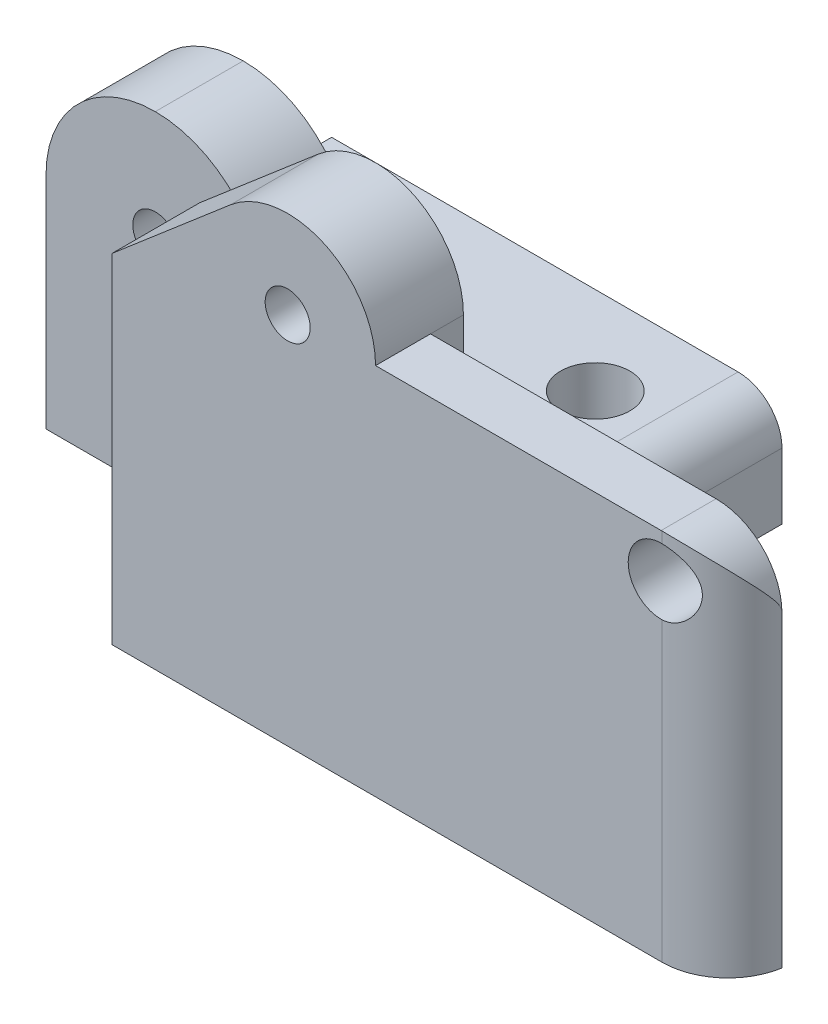
ISO-10303-21;
HEADER;
FILE_DESCRIPTION(('STEP AP214'),'2;1');
FILE_NAME('part.step','',(''),(''),'','','');
FILE_SCHEMA(('AUTOMOTIVE_DESIGN { 1 0 10303 214 1 1 1 1 }'));
ENDSEC;
DATA;
#1=APPLICATION_CONTEXT('core data for automotive mechanical design processes');
#2=APPLICATION_PROTOCOL_DEFINITION('international standard','automotive_design',2000,#1);
#3=PRODUCT_CONTEXT('',#1,'mechanical');
#4=PRODUCT('Part','Part','',(#3));
#5=PRODUCT_RELATED_PRODUCT_CATEGORY('part','',(#4));
#6=PRODUCT_DEFINITION_FORMATION('','',#4);
#7=PRODUCT_DEFINITION_CONTEXT('part definition',#1,'design');
#8=PRODUCT_DEFINITION('design','',#6,#7);
#9=PRODUCT_DEFINITION_SHAPE('','',#8);
#10=(LENGTH_UNIT() NAMED_UNIT(*) SI_UNIT(.MILLI.,.METRE.));
#11=(NAMED_UNIT(*) PLANE_ANGLE_UNIT() SI_UNIT($,.RADIAN.));
#12=(NAMED_UNIT(*) SI_UNIT($,.STERADIAN.) SOLID_ANGLE_UNIT());
#13=UNCERTAINTY_MEASURE_WITH_UNIT(LENGTH_MEASURE(1.E-05),#10,'distance_accuracy_value','');
#14=(GEOMETRIC_REPRESENTATION_CONTEXT(3) GLOBAL_UNCERTAINTY_ASSIGNED_CONTEXT((#13)) GLOBAL_UNIT_ASSIGNED_CONTEXT((#10,
#11,#12)) REPRESENTATION_CONTEXT('',''));
#15=CARTESIAN_POINT('',(0.,0.,0.));
#16=DIRECTION('',(0.,0.,1.));
#17=DIRECTION('',(1.,0.,0.));
#18=AXIS2_PLACEMENT_3D('',#15,#16,#17);
#19=CARTESIAN_POINT('',(16.,17.,20.));
#20=DIRECTION('',(-1.,0.,0.));
#21=DIRECTION('',(0.,0.,1.));
#22=AXIS2_PLACEMENT_3D('',#19,#20,#21);
#23=PLANE('',#22);
#24=DIRECTION('',(0.,1.,0.));
#25=VECTOR('',#24,1.);
#26=CARTESIAN_POINT('',(16.,0.,17.5));
#27=LINE('',#26,#25);
#28=CARTESIAN_POINT('',(16.,0.,17.5));
#29=VERTEX_POINT('',#28);
#30=CARTESIAN_POINT('',(16.,17.,17.5));
#31=VERTEX_POINT('',#30);
#32=EDGE_CURVE('E213',#29,#31,#27,.T.);
#33=ORIENTED_EDGE('',*,*,#32,.F.);
#34=DIRECTION('',(0.,0.,-1.));
#35=VECTOR('',#34,1.);
#36=CARTESIAN_POINT('',(16.,0.,20.));
#37=LINE('',#36,#35);
#38=CARTESIAN_POINT('',(16.,0.,16.));
#39=VERTEX_POINT('',#38);
#40=EDGE_CURVE('E439',#29,#39,#37,.T.);
#41=ORIENTED_EDGE('',*,*,#40,.T.);
#42=DIRECTION('',(0.,-1.,0.));
#43=VECTOR('',#42,1.);
#44=CARTESIAN_POINT('',(16.,5.,16.));
#45=LINE('',#44,#43);
#46=CARTESIAN_POINT('',(16.,17.,16.));
#47=VERTEX_POINT('',#46);
#48=EDGE_CURVE('E411',#47,#39,#45,.T.);
#49=ORIENTED_EDGE('',*,*,#48,.F.);
#50=DIRECTION('',(0.,0.,-1.));
#51=VECTOR('',#50,1.);
#52=CARTESIAN_POINT('',(16.,17.,20.));
#53=LINE('',#52,#51);
#54=EDGE_CURVE('E435',#31,#47,#53,.T.);
#55=ORIENTED_EDGE('',*,*,#54,.F.);
#56=EDGE_LOOP('',(#33,#41,#49,#55));
#57=FACE_BOUND('',#56,.T.);
#58=ADVANCED_FACE('F41',(#57),#23,.F.);
#59=CARTESIAN_POINT('',(12.,17.,20.));
#60=DIRECTION('',(0.,0.,-1.));
#61=DIRECTION('',(-1.,0.,0.));
#62=AXIS2_PLACEMENT_3D('',#59,#60,#61);
#63=PLANE('',#62);
#64=DIRECTION('',(0.,1.,0.));
#65=VECTOR('',#64,1.);
#66=CARTESIAN_POINT('',(29.0419601084502,17.,20.));
#67=LINE('',#66,#65);
#68=CARTESIAN_POINT('',(29.0419601084502,0.,20.));
#69=VERTEX_POINT('',#68);
#70=CARTESIAN_POINT('',(29.0419601084502,13.5005869984228,20.));
#71=VERTEX_POINT('',#70);
#72=EDGE_CURVE('E190',#69,#71,#67,.T.);
#73=ORIENTED_EDGE('',*,*,#72,.T.);
#74=CARTESIAN_POINT('',(29.,15.,20.));
#75=DIRECTION('',(0.,0.,1.));
#76=DIRECTION('',(1.,0.,0.));
#77=AXIS2_PLACEMENT_3D('',#74,#75,#76);
#78=CIRCLE('',#77,1.5);
#79=CARTESIAN_POINT('',(29.0419601084502,16.4994130015772,20.));
#80=VERTEX_POINT('',#79);
#81=EDGE_CURVE('E60',#80,#71,#78,.T.);
#82=ORIENTED_EDGE('',*,*,#81,.F.);
#83=CARTESIAN_POINT('',(29.0419601084502,16.9997065438637,20.));
#84=VERTEX_POINT('',#83);
#85=EDGE_CURVE('E187',#80,#84,#67,.T.);
#86=ORIENTED_EDGE('',*,*,#85,.T.);
#87=CARTESIAN_POINT('',(29.,14.,20.));
#88=DIRECTION('',(0.,0.,-1.));
#89=DIRECTION('',(-1.,0.,0.));
#90=AXIS2_PLACEMENT_3D('',#87,#88,#89);
#91=CIRCLE('',#90,3.);
#92=CARTESIAN_POINT('',(29.,17.,20.));
#93=VERTEX_POINT('',#92);
#94=EDGE_CURVE('E199',#84,#93,#91,.F.);
#95=ORIENTED_EDGE('',*,*,#94,.T.);
#96=DIRECTION('',(-1.,0.,0.));
#97=VECTOR('',#96,1.);
#98=CARTESIAN_POINT('',(32.,17.,20.));
#99=LINE('',#98,#97);
#100=CARTESIAN_POINT('',(16.,17.,20.));
#101=VERTEX_POINT('',#100);
#102=EDGE_CURVE('E323',#93,#101,#99,.T.);
#103=ORIENTED_EDGE('',*,*,#102,.T.);
#104=CARTESIAN_POINT('',(12.,17.,20.));
#105=DIRECTION('',(0.,0.,1.));
#106=DIRECTION('',(-1.,0.,0.));
#107=AXIS2_PLACEMENT_3D('',#104,#105,#106);
#108=CIRCLE('',#107,4.);
#109=CARTESIAN_POINT('',(9.40008084297598,20.0398059768577,20.));
#110=VERTEX_POINT('',#109);
#111=EDGE_CURVE('E425',#101,#110,#108,.T.);
#112=ORIENTED_EDGE('',*,*,#111,.T.);
#113=DIRECTION('',(-0.759951494214413,-0.649979789256005,0.));
#114=VECTOR('',#113,1.);
#115=CARTESIAN_POINT('',(0.,12.,20.));
#116=LINE('',#115,#114);
#117=CARTESIAN_POINT('',(4.,15.4211646096066,20.));
#118=VERTEX_POINT('',#117);
#119=EDGE_CURVE('E427',#110,#118,#116,.T.);
#120=ORIENTED_EDGE('',*,*,#119,.T.);
#121=DIRECTION('',(0.,1.,0.));
#122=VECTOR('',#121,1.);
#123=CARTESIAN_POINT('',(4.,0.,20.));
#124=LINE('',#123,#122);
#125=CARTESIAN_POINT('',(4.,0.,20.));
#126=VERTEX_POINT('',#125);
#127=EDGE_CURVE('E401',#126,#118,#124,.T.);
#128=ORIENTED_EDGE('',*,*,#127,.F.);
#129=DIRECTION('',(1.,0.,0.));
#130=VECTOR('',#129,1.);
#131=CARTESIAN_POINT('',(16.,0.,20.));
#132=LINE('',#131,#130);
#133=EDGE_CURVE('E423',#126,#69,#132,.T.);
#134=ORIENTED_EDGE('',*,*,#133,.T.);
#135=EDGE_LOOP('',(#73,#82,#86,#95,#103,#112,#120,#128,#134));
#136=FACE_BOUND('',#135,.T.);
#137=CARTESIAN_POINT('',(12.,17.,20.));
#138=DIRECTION('',(0.,0.,1.));
#139=DIRECTION('',(1.,0.,0.));
#140=AXIS2_PLACEMENT_3D('',#137,#138,#139);
#141=CIRCLE('',#140,1.025);
#142=CARTESIAN_POINT('',(13.025,17.,20.));
#143=VERTEX_POINT('',#142);
#144=EDGE_CURVE('E328',#143,#143,#141,.T.);
#145=ORIENTED_EDGE('',*,*,#144,.F.);
#146=EDGE_LOOP('',(#145));
#147=FACE_BOUND('',#146,.T.);
#148=ADVANCED_FACE('F185',(#136,#147),#63,.F.);
#149=CARTESIAN_POINT('',(-6.,5.,13.));
#150=DIRECTION('',(0.,0.,-1.));
#151=DIRECTION('',(-1.,0.,0.));
#152=AXIS2_PLACEMENT_3D('',#149,#150,#151);
#153=PLANE('',#152);
#154=DIRECTION('',(0.,-1.,0.));
#155=VECTOR('',#154,1.);
#156=CARTESIAN_POINT('',(3.95,15.,13.));
#157=LINE('',#156,#155);
#158=CARTESIAN_POINT('',(3.95,10.025,13.));
#159=VERTEX_POINT('',#158);
#160=CARTESIAN_POINT('',(3.95,5.,13.));
#161=VERTEX_POINT('',#160);
#162=EDGE_CURVE('E368',#159,#161,#157,.T.);
#163=ORIENTED_EDGE('',*,*,#162,.F.);
#164=CARTESIAN_POINT('',(-1.025,10.025,13.));
#165=DIRECTION('',(0.,0.,-1.));
#166=DIRECTION('',(-1.,0.,0.));
#167=AXIS2_PLACEMENT_3D('',#164,#165,#166);
#168=CIRCLE('',#167,4.975);
#169=CARTESIAN_POINT('',(-1.025,15.,13.));
#170=VERTEX_POINT('',#169);
#171=EDGE_CURVE('E460',#159,#170,#168,.F.);
#172=ORIENTED_EDGE('',*,*,#171,.T.);
#173=CARTESIAN_POINT('',(-1.025,10.025,13.));
#174=DIRECTION('',(0.,0.,-1.));
#175=DIRECTION('',(-1.,0.,0.));
#176=AXIS2_PLACEMENT_3D('',#173,#174,#175);
#177=CIRCLE('',#176,4.975);
#178=CARTESIAN_POINT('',(-6.,10.025,13.));
#179=VERTEX_POINT('',#178);
#180=EDGE_CURVE('E458',#170,#179,#177,.F.);
#181=ORIENTED_EDGE('',*,*,#180,.T.);
#182=DIRECTION('',(0.,1.,0.));
#183=VECTOR('',#182,1.);
#184=CARTESIAN_POINT('',(-6.,5.,13.));
#185=LINE('',#184,#183);
#186=CARTESIAN_POINT('',(-6.,0.,13.));
#187=VERTEX_POINT('',#186);
#188=EDGE_CURVE('E388',#187,#179,#185,.T.);
#189=ORIENTED_EDGE('',*,*,#188,.F.);
#190=DIRECTION('',(1.,0.,0.));
#191=VECTOR('',#190,1.);
#192=CARTESIAN_POINT('',(-6.,0.,13.));
#193=LINE('',#192,#191);
#194=CARTESIAN_POINT('',(4.,0.,13.));
#195=VERTEX_POINT('',#194);
#196=EDGE_CURVE('E398',#187,#195,#193,.T.);
#197=ORIENTED_EDGE('',*,*,#196,.T.);
#198=DIRECTION('',(0.,1.,0.));
#199=VECTOR('',#198,1.);
#200=CARTESIAN_POINT('',(4.,5.,13.));
#201=LINE('',#200,#199);
#202=CARTESIAN_POINT('',(4.,5.,13.));
#203=VERTEX_POINT('',#202);
#204=EDGE_CURVE('E386',#195,#203,#201,.T.);
#205=ORIENTED_EDGE('',*,*,#204,.T.);
#206=DIRECTION('',(1.,0.,0.));
#207=VECTOR('',#206,1.);
#208=CARTESIAN_POINT('',(-6.,5.,13.));
#209=LINE('',#208,#207);
#210=EDGE_CURVE('E394',#161,#203,#209,.T.);
#211=ORIENTED_EDGE('',*,*,#210,.F.);
#212=EDGE_LOOP('',(#163,#172,#181,#189,#197,#205,#211));
#213=FACE_BOUND('',#212,.T.);
#214=CARTESIAN_POINT('',(-1.025,10.025,13.));
#215=DIRECTION('',(0.,0.,1.));
#216=DIRECTION('',(1.,0.,0.));
#217=AXIS2_PLACEMENT_3D('',#214,#215,#216);
#218=CIRCLE('',#217,1.02499999999999);
#219=CARTESIAN_POINT('',(0.,10.025,13.));
#220=VERTEX_POINT('',#219);
#221=EDGE_CURVE('E349',#220,#220,#218,.T.);
#222=ORIENTED_EDGE('',*,*,#221,.F.);
#223=EDGE_LOOP('',(#222));
#224=FACE_BOUND('',#223,.T.);
#225=ADVANCED_FACE('F258',(#213,#224),#153,.F.);
#226=CARTESIAN_POINT('',(-4.,5.,0.));
#227=DIRECTION('',(0.,-1.,0.));
#228=DIRECTION('',(0.,0.,-1.));
#229=AXIS2_PLACEMENT_3D('',#226,#227,#228);
#230=PLANE('',#229);
#231=CARTESIAN_POINT('',(10.,5.,14.));
#232=DIRECTION('',(0.,-1.,0.));
#233=DIRECTION('',(0.,0.,-1.));
#234=AXIS2_PLACEMENT_3D('',#231,#232,#233);
#235=CIRCLE('',#234,1.575);
#236=CARTESIAN_POINT('',(10.,5.,12.425));
#237=VERTEX_POINT('',#236);
#238=EDGE_CURVE('E381',#237,#237,#235,.T.);
#239=ORIENTED_EDGE('',*,*,#238,.T.);
#240=EDGE_LOOP('',(#239));
#241=FACE_BOUND('',#240,.T.);
#242=CARTESIAN_POINT('',(10.,5.,4.));
#243=DIRECTION('',(0.,-1.,0.));
#244=DIRECTION('',(0.,0.,-1.));
#245=AXIS2_PLACEMENT_3D('',#242,#243,#244);
#246=CIRCLE('',#245,1.575);
#247=CARTESIAN_POINT('',(10.,5.,2.425));
#248=VERTEX_POINT('',#247);
#249=EDGE_CURVE('E377',#248,#248,#246,.T.);
#250=ORIENTED_EDGE('',*,*,#249,.T.);
#251=EDGE_LOOP('',(#250));
#252=FACE_BOUND('',#251,.T.);
#253=CARTESIAN_POINT('',(-2.,5.,4.));
#254=DIRECTION('',(0.,-1.,0.));
#255=DIRECTION('',(0.,0.,-1.));
#256=AXIS2_PLACEMENT_3D('',#253,#254,#255);
#257=CIRCLE('',#256,1.575);
#258=CARTESIAN_POINT('',(-2.,5.,2.425));
#259=VERTEX_POINT('',#258);
#260=EDGE_CURVE('E373',#259,#259,#257,.T.);
#261=ORIENTED_EDGE('',*,*,#260,.T.);
#262=EDGE_LOOP('',(#261));
#263=FACE_BOUND('',#262,.T.);
#264=DIRECTION('',(1.,0.,0.));
#265=VECTOR('',#264,1.);
#266=CARTESIAN_POINT('',(-4.,5.,16.));
#267=LINE('',#266,#265);
#268=CARTESIAN_POINT('',(4.,5.,16.));
#269=VERTEX_POINT('',#268);
#270=CARTESIAN_POINT('',(12.5,5.,16.));
#271=VERTEX_POINT('',#270);
#272=EDGE_CURVE('E414',#269,#271,#267,.T.);
#273=ORIENTED_EDGE('',*,*,#272,.T.);
#274=DIRECTION('',(0.,0.,1.));
#275=VECTOR('',#274,1.);
#276=CARTESIAN_POINT('',(12.5,5.,0.));
#277=LINE('',#276,#275);
#278=CARTESIAN_POINT('',(12.5,5.,0.));
#279=VERTEX_POINT('',#278);
#280=EDGE_CURVE('E469',#271,#279,#277,.F.);
#281=ORIENTED_EDGE('',*,*,#280,.T.);
#282=DIRECTION('',(-1.,0.,0.));
#283=VECTOR('',#282,1.);
#284=CARTESIAN_POINT('',(12.,5.,0.));
#285=LINE('',#284,#283);
#286=CARTESIAN_POINT('',(-6.,5.,0.));
#287=VERTEX_POINT('',#286);
#288=EDGE_CURVE('E441',#279,#287,#285,.T.);
#289=ORIENTED_EDGE('',*,*,#288,.T.);
#290=DIRECTION('',(0.,0.,-1.));
#291=VECTOR('',#290,1.);
#292=CARTESIAN_POINT('',(-6.,5.,0.));
#293=LINE('',#292,#291);
#294=CARTESIAN_POINT('',(-6.,5.,9.));
#295=VERTEX_POINT('',#294);
#296=EDGE_CURVE('E391',#295,#287,#293,.T.);
#297=ORIENTED_EDGE('',*,*,#296,.F.);
#298=DIRECTION('',(-1.,0.,0.));
#299=VECTOR('',#298,1.);
#300=CARTESIAN_POINT('',(-6.,5.,9.));
#301=LINE('',#300,#299);
#302=CARTESIAN_POINT('',(3.95,5.,9.));
#303=VERTEX_POINT('',#302);
#304=EDGE_CURVE('E361',#303,#295,#301,.T.);
#305=ORIENTED_EDGE('',*,*,#304,.F.);
#306=DIRECTION('',(0.,0.,-1.));
#307=VECTOR('',#306,1.);
#308=CARTESIAN_POINT('',(3.95,5.,13.));
#309=LINE('',#308,#307);
#310=EDGE_CURVE('E358',#161,#303,#309,.T.);
#311=ORIENTED_EDGE('',*,*,#310,.F.);
#312=ORIENTED_EDGE('',*,*,#210,.T.);
#313=DIRECTION('',(0.,0.,1.));
#314=VECTOR('',#313,1.);
#315=CARTESIAN_POINT('',(4.,5.,0.));
#316=LINE('',#315,#314);
#317=EDGE_CURVE('E443',#203,#269,#316,.T.);
#318=ORIENTED_EDGE('',*,*,#317,.T.);
#319=EDGE_LOOP('',(#273,#281,#289,#297,#305,#311,#312,#318));
#320=FACE_BOUND('',#319,.T.);
#321=ADVANCED_FACE('F263',(#241,#252,#263,#320),#230,.F.);
#322=CARTESIAN_POINT('',(4.,0.,0.));
#323=DIRECTION('',(1.,0.,0.));
#324=DIRECTION('',(0.,0.,-1.));
#325=AXIS2_PLACEMENT_3D('',#322,#323,#324);
#326=PLANE('',#325);
#327=ORIENTED_EDGE('',*,*,#204,.F.);
#328=DIRECTION('',(0.,0.,1.));
#329=VECTOR('',#328,1.);
#330=CARTESIAN_POINT('',(4.,0.,0.));
#331=LINE('',#330,#329);
#332=EDGE_CURVE('E403',#195,#126,#331,.T.);
#333=ORIENTED_EDGE('',*,*,#332,.T.);
#334=ORIENTED_EDGE('',*,*,#127,.T.);
#335=DIRECTION('',(0.,0.,1.));
#336=VECTOR('',#335,1.);
#337=CARTESIAN_POINT('',(4.,15.4211646096066,0.));
#338=LINE('',#337,#336);
#339=CARTESIAN_POINT('',(4.,15.4211646096066,16.));
#340=VERTEX_POINT('',#339);
#341=EDGE_CURVE('E404',#340,#118,#338,.T.);
#342=ORIENTED_EDGE('',*,*,#341,.F.);
#343=DIRECTION('',(0.,1.,0.));
#344=VECTOR('',#343,1.);
#345=CARTESIAN_POINT('',(4.,5.,16.));
#346=LINE('',#345,#344);
#347=EDGE_CURVE('E407',#269,#340,#346,.T.);
#348=ORIENTED_EDGE('',*,*,#347,.F.);
#349=ORIENTED_EDGE('',*,*,#317,.F.);
#350=EDGE_LOOP('',(#327,#333,#334,#342,#348,#349));
#351=FACE_BOUND('',#350,.T.);
#352=ADVANCED_FACE('F239',(#351),#326,.F.);
#353=CARTESIAN_POINT('',(16.,0.,20.));
#354=DIRECTION('',(0.,1.,0.));
#355=DIRECTION('',(0.,0.,1.));
#356=AXIS2_PLACEMENT_3D('',#353,#354,#355);
#357=PLANE('',#356);
#358=CARTESIAN_POINT('',(-2.,0.,4.));
#359=DIRECTION('',(0.,-1.,0.));
#360=DIRECTION('',(0.,0.,-1.));
#361=AXIS2_PLACEMENT_3D('',#358,#359,#360);
#362=CIRCLE('',#361,1.575);
#363=CARTESIAN_POINT('',(-2.,0.,2.425));
#364=VERTEX_POINT('',#363);
#365=EDGE_CURVE('E370',#364,#364,#362,.T.);
#366=ORIENTED_EDGE('',*,*,#365,.F.);
#367=EDGE_LOOP('',(#366));
#368=FACE_BOUND('',#367,.T.);
#369=CARTESIAN_POINT('',(10.,0.,4.));
#370=DIRECTION('',(0.,-1.,0.));
#371=DIRECTION('',(0.,0.,-1.));
#372=AXIS2_PLACEMENT_3D('',#369,#370,#371);
#373=CIRCLE('',#372,1.575);
#374=CARTESIAN_POINT('',(10.,0.,2.425));
#375=VERTEX_POINT('',#374);
#376=EDGE_CURVE('E374',#375,#375,#373,.T.);
#377=ORIENTED_EDGE('',*,*,#376,.F.);
#378=EDGE_LOOP('',(#377));
#379=FACE_BOUND('',#378,.T.);
#380=CARTESIAN_POINT('',(10.,0.,14.));
#381=DIRECTION('',(0.,-1.,0.));
#382=DIRECTION('',(0.,0.,-1.));
#383=AXIS2_PLACEMENT_3D('',#380,#381,#382);
#384=CIRCLE('',#383,1.575);
#385=CARTESIAN_POINT('',(10.,0.,12.425));
#386=VERTEX_POINT('',#385);
#387=EDGE_CURVE('E378',#386,#386,#384,.T.);
#388=ORIENTED_EDGE('',*,*,#387,.F.);
#389=EDGE_LOOP('',(#388));
#390=FACE_BOUND('',#389,.T.);
#391=DIRECTION('',(-1.,0.,0.));
#392=VECTOR('',#391,1.);
#393=CARTESIAN_POINT('',(32.,0.,17.5));
#394=LINE('',#393,#392);
#395=CARTESIAN_POINT('',(32.,0.,17.5));
#396=VERTEX_POINT('',#395);
#397=EDGE_CURVE('E326',#396,#29,#394,.T.);
#398=ORIENTED_EDGE('',*,*,#397,.F.);
#399=CARTESIAN_POINT('',(29.0419601084502,0.,17.));
#400=DIRECTION('',(0.,1.,0.));
#401=DIRECTION('',(0.,0.,1.));
#402=AXIS2_PLACEMENT_3D('',#399,#400,#401);
#403=CIRCLE('',#402,3.);
#404=EDGE_CURVE('E55',#396,#69,#403,.F.);
#405=ORIENTED_EDGE('',*,*,#404,.T.);
#406=ORIENTED_EDGE('',*,*,#133,.F.);
#407=ORIENTED_EDGE('',*,*,#332,.F.);
#408=ORIENTED_EDGE('',*,*,#196,.F.);
#409=DIRECTION('',(0.,0.,1.));
#410=VECTOR('',#409,1.);
#411=CARTESIAN_POINT('',(-6.,0.,13.));
#412=LINE('',#411,#410);
#413=CARTESIAN_POINT('',(-6.,0.,0.));
#414=VERTEX_POINT('',#413);
#415=EDGE_CURVE('E385',#414,#187,#412,.T.);
#416=ORIENTED_EDGE('',*,*,#415,.F.);
#417=DIRECTION('',(1.,0.,0.));
#418=VECTOR('',#417,1.);
#419=CARTESIAN_POINT('',(16.,0.,0.));
#420=LINE('',#419,#418);
#421=CARTESIAN_POINT('',(14.5,0.,0.));
#422=VERTEX_POINT('',#421);
#423=EDGE_CURVE('E422',#414,#422,#420,.T.);
#424=ORIENTED_EDGE('',*,*,#423,.T.);
#425=DIRECTION('',(0.,0.,1.));
#426=VECTOR('',#425,1.);
#427=CARTESIAN_POINT('',(14.5,0.,0.));
#428=LINE('',#427,#426);
#429=CARTESIAN_POINT('',(14.5,0.,16.));
#430=VERTEX_POINT('',#429);
#431=EDGE_CURVE('E339',#422,#430,#428,.T.);
#432=ORIENTED_EDGE('',*,*,#431,.T.);
#433=DIRECTION('',(1.,0.,0.));
#434=VECTOR('',#433,1.);
#435=CARTESIAN_POINT('',(16.,0.,16.));
#436=LINE('',#435,#434);
#437=EDGE_CURVE('E342',#430,#39,#436,.T.);
#438=ORIENTED_EDGE('',*,*,#437,.T.);
#439=ORIENTED_EDGE('',*,*,#40,.F.);
#440=EDGE_LOOP('',(#398,#405,#406,#407,#408,#416,#424,#432,#438,#439));
#441=FACE_BOUND('',#440,.T.);
#442=ADVANCED_FACE('F235',(#368,#379,#390,#441),#357,.F.);
#443=CARTESIAN_POINT('',(12.,17.,20.));
#444=DIRECTION('',(0.,0.,-1.));
#445=DIRECTION('',(-1.,0.,0.));
#446=AXIS2_PLACEMENT_3D('',#443,#444,#445);
#447=CYLINDRICAL_SURFACE('',#446,4.);
#448=EDGE_CURVE('E436',#101,#31,#53,.T.);
#449=ORIENTED_EDGE('',*,*,#448,.T.);
#450=ORIENTED_EDGE('',*,*,#54,.T.);
#451=CARTESIAN_POINT('',(12.,17.,16.));
#452=DIRECTION('',(0.,0.,1.));
#453=DIRECTION('',(1.,0.,0.));
#454=AXIS2_PLACEMENT_3D('',#451,#452,#453);
#455=CIRCLE('',#454,4.);
#456=CARTESIAN_POINT('',(9.40008084297598,20.0398059768577,16.));
#457=VERTEX_POINT('',#456);
#458=EDGE_CURVE('E420',#47,#457,#455,.T.);
#459=ORIENTED_EDGE('',*,*,#458,.T.);
#460=DIRECTION('',(0.,0.,-1.));
#461=VECTOR('',#460,1.);
#462=CARTESIAN_POINT('',(9.40008084297598,20.0398059768577,20.));
#463=LINE('',#462,#461);
#464=EDGE_CURVE('E430',#110,#457,#463,.T.);
#465=ORIENTED_EDGE('',*,*,#464,.F.);
#466=ORIENTED_EDGE('',*,*,#111,.F.);
#467=EDGE_LOOP('',(#449,#450,#459,#465,#466));
#468=FACE_BOUND('',#467,.T.);
#469=ADVANCED_FACE('F238',(#468),#447,.T.);
#470=CARTESIAN_POINT('',(0.,12.,20.));
#471=DIRECTION('',(0.649979789256005,-0.759951494214413,0.));
#472=DIRECTION('',(0.759951494214413,0.649979789256005,0.));
#473=AXIS2_PLACEMENT_3D('',#470,#471,#472);
#474=PLANE('',#473);
#475=DIRECTION('',(-0.759951494214413,-0.649979789256005,0.));
#476=VECTOR('',#475,1.);
#477=CARTESIAN_POINT('',(0.,12.,16.));
#478=LINE('',#477,#476);
#479=EDGE_CURVE('E417',#457,#340,#478,.T.);
#480=ORIENTED_EDGE('',*,*,#479,.T.);
#481=ORIENTED_EDGE('',*,*,#341,.T.);
#482=ORIENTED_EDGE('',*,*,#119,.F.);
#483=ORIENTED_EDGE('',*,*,#464,.T.);
#484=EDGE_LOOP('',(#480,#481,#482,#483));
#485=FACE_BOUND('',#484,.T.);
#486=ADVANCED_FACE('F246',(#485),#474,.F.);
#487=CARTESIAN_POINT('',(12.,17.,0.));
#488=DIRECTION('',(0.,0.,-1.));
#489=DIRECTION('',(-1.,0.,0.));
#490=AXIS2_PLACEMENT_3D('',#487,#488,#489);
#491=PLANE('',#490);
#492=ORIENTED_EDGE('',*,*,#288,.F.);
#493=CARTESIAN_POINT('',(12.5,3.,0.));
#494=DIRECTION('',(0.,0.,-1.));
#495=DIRECTION('',(-1.,0.,0.));
#496=AXIS2_PLACEMENT_3D('',#493,#494,#495);
#497=CIRCLE('',#496,2.);
#498=CARTESIAN_POINT('',(14.5,3.,0.));
#499=VERTEX_POINT('',#498);
#500=EDGE_CURVE('E200',#279,#499,#497,.T.);
#501=ORIENTED_EDGE('',*,*,#500,.T.);
#502=DIRECTION('',(0.,1.,0.));
#503=VECTOR('',#502,1.);
#504=CARTESIAN_POINT('',(14.5,0.,0.));
#505=LINE('',#504,#503);
#506=EDGE_CURVE('E345',#422,#499,#505,.T.);
#507=ORIENTED_EDGE('',*,*,#506,.F.);
#508=ORIENTED_EDGE('',*,*,#423,.F.);
#509=DIRECTION('',(0.,-1.,0.));
#510=VECTOR('',#509,1.);
#511=CARTESIAN_POINT('',(-6.,0.,0.));
#512=LINE('',#511,#510);
#513=EDGE_CURVE('E382',#287,#414,#512,.T.);
#514=ORIENTED_EDGE('',*,*,#513,.F.);
#515=EDGE_LOOP('',(#492,#501,#507,#508,#514));
#516=FACE_BOUND('',#515,.T.);
#517=ADVANCED_FACE('F250',(#516),#491,.T.);
#518=CARTESIAN_POINT('',(-4.,5.,16.));
#519=DIRECTION('',(0.,0.,1.));
#520=DIRECTION('',(1.,0.,0.));
#521=AXIS2_PLACEMENT_3D('',#518,#519,#520);
#522=PLANE('',#521);
#523=CARTESIAN_POINT('',(12.,17.,16.));
#524=DIRECTION('',(0.,0.,1.));
#525=DIRECTION('',(1.,0.,0.));
#526=AXIS2_PLACEMENT_3D('',#523,#524,#525);
#527=CIRCLE('',#526,1.025);
#528=CARTESIAN_POINT('',(13.025,17.,16.));
#529=VERTEX_POINT('',#528);
#530=EDGE_CURVE('E336',#529,#529,#527,.T.);
#531=ORIENTED_EDGE('',*,*,#530,.T.);
#532=EDGE_LOOP('',(#531));
#533=FACE_BOUND('',#532,.T.);
#534=ORIENTED_EDGE('',*,*,#272,.F.);
#535=ORIENTED_EDGE('',*,*,#347,.T.);
#536=ORIENTED_EDGE('',*,*,#479,.F.);
#537=ORIENTED_EDGE('',*,*,#458,.F.);
#538=ORIENTED_EDGE('',*,*,#48,.T.);
#539=ORIENTED_EDGE('',*,*,#437,.F.);
#540=DIRECTION('',(0.,1.,0.));
#541=VECTOR('',#540,1.);
#542=CARTESIAN_POINT('',(14.5,0.,16.));
#543=LINE('',#542,#541);
#544=CARTESIAN_POINT('',(14.5,3.,16.));
#545=VERTEX_POINT('',#544);
#546=EDGE_CURVE('E346',#430,#545,#543,.T.);
#547=ORIENTED_EDGE('',*,*,#546,.T.);
#548=CARTESIAN_POINT('',(12.5,3.,16.));
#549=DIRECTION('',(0.,0.,1.));
#550=DIRECTION('',(1.,0.,0.));
#551=AXIS2_PLACEMENT_3D('',#548,#549,#550);
#552=CIRCLE('',#551,2.);
#553=EDGE_CURVE('E197',#545,#271,#552,.T.);
#554=ORIENTED_EDGE('',*,*,#553,.T.);
#555=EDGE_LOOP('',(#534,#535,#536,#537,#538,#539,#547,#554));
#556=FACE_BOUND('',#555,.T.);
#557=ADVANCED_FACE('F254',(#533,#556),#522,.F.);
#558=CARTESIAN_POINT('',(-6.,0.,0.));
#559=DIRECTION('',(1.,0.,0.));
#560=DIRECTION('',(0.,0.,-1.));
#561=AXIS2_PLACEMENT_3D('',#558,#559,#560);
#562=PLANE('',#561);
#563=ORIENTED_EDGE('',*,*,#188,.T.);
#564=DIRECTION('',(0.,0.,1.));
#565=VECTOR('',#564,1.);
#566=CARTESIAN_POINT('',(-6.,10.025,0.));
#567=LINE('',#566,#565);
#568=CARTESIAN_POINT('',(-6.,10.025,9.));
#569=VERTEX_POINT('',#568);
#570=EDGE_CURVE('E462',#179,#569,#567,.F.);
#571=ORIENTED_EDGE('',*,*,#570,.T.);
#572=DIRECTION('',(0.,-1.,0.));
#573=VECTOR('',#572,1.);
#574=CARTESIAN_POINT('',(-6.,15.,9.));
#575=LINE('',#574,#573);
#576=EDGE_CURVE('E364',#569,#295,#575,.T.);
#577=ORIENTED_EDGE('',*,*,#576,.T.);
#578=ORIENTED_EDGE('',*,*,#296,.T.);
#579=ORIENTED_EDGE('',*,*,#513,.T.);
#580=ORIENTED_EDGE('',*,*,#415,.T.);
#581=EDGE_LOOP('',(#563,#571,#577,#578,#579,#580));
#582=FACE_BOUND('',#581,.T.);
#583=ADVANCED_FACE('F261',(#582),#562,.F.);
#584=CARTESIAN_POINT('',(10.,0.,14.));
#585=DIRECTION('',(0.,-1.,0.));
#586=DIRECTION('',(0.,0.,-1.));
#587=AXIS2_PLACEMENT_3D('',#584,#585,#586);
#588=CYLINDRICAL_SURFACE('',#587,1.575);
#589=ORIENTED_EDGE('',*,*,#387,.T.);
#590=EDGE_LOOP('',(#589));
#591=FACE_BOUND('',#590,.T.);
#592=ORIENTED_EDGE('',*,*,#238,.F.);
#593=EDGE_LOOP('',(#592));
#594=FACE_BOUND('',#593,.T.);
#595=ADVANCED_FACE('F275',(#591,#594),#588,.F.);
#596=CARTESIAN_POINT('',(10.,0.,4.));
#597=DIRECTION('',(0.,-1.,0.));
#598=DIRECTION('',(0.,0.,-1.));
#599=AXIS2_PLACEMENT_3D('',#596,#597,#598);
#600=CYLINDRICAL_SURFACE('',#599,1.575);
#601=ORIENTED_EDGE('',*,*,#376,.T.);
#602=EDGE_LOOP('',(#601));
#603=FACE_BOUND('',#602,.T.);
#604=ORIENTED_EDGE('',*,*,#249,.F.);
#605=EDGE_LOOP('',(#604));
#606=FACE_BOUND('',#605,.T.);
#607=ADVANCED_FACE('F279',(#603,#606),#600,.F.);
#608=CARTESIAN_POINT('',(-2.,0.,4.));
#609=DIRECTION('',(0.,-1.,0.));
#610=DIRECTION('',(0.,0.,-1.));
#611=AXIS2_PLACEMENT_3D('',#608,#609,#610);
#612=CYLINDRICAL_SURFACE('',#611,1.575);
#613=ORIENTED_EDGE('',*,*,#365,.T.);
#614=EDGE_LOOP('',(#613));
#615=FACE_BOUND('',#614,.T.);
#616=ORIENTED_EDGE('',*,*,#260,.F.);
#617=EDGE_LOOP('',(#616));
#618=FACE_BOUND('',#617,.T.);
#619=ADVANCED_FACE('F283',(#615,#618),#612,.F.);
#620=CARTESIAN_POINT('',(3.95,15.,13.));
#621=DIRECTION('',(-1.,0.,0.));
#622=DIRECTION('',(0.,0.,1.));
#623=AXIS2_PLACEMENT_3D('',#620,#621,#622);
#624=PLANE('',#623);
#625=DIRECTION('',(0.,-1.,0.));
#626=VECTOR('',#625,1.);
#627=CARTESIAN_POINT('',(3.95,15.,9.));
#628=LINE('',#627,#626);
#629=CARTESIAN_POINT('',(3.95,10.025,9.));
#630=VERTEX_POINT('',#629);
#631=EDGE_CURVE('E366',#630,#303,#628,.T.);
#632=ORIENTED_EDGE('',*,*,#631,.F.);
#633=DIRECTION('',(0.,0.,-1.));
#634=VECTOR('',#633,1.);
#635=CARTESIAN_POINT('',(3.95,10.025,13.));
#636=LINE('',#635,#634);
#637=EDGE_CURVE('E455',#630,#159,#636,.F.);
#638=ORIENTED_EDGE('',*,*,#637,.T.);
#639=ORIENTED_EDGE('',*,*,#162,.T.);
#640=ORIENTED_EDGE('',*,*,#310,.T.);
#641=EDGE_LOOP('',(#632,#638,#639,#640));
#642=FACE_BOUND('',#641,.T.);
#643=ADVANCED_FACE('F287',(#642),#624,.F.);
#644=CARTESIAN_POINT('',(-6.,15.,9.));
#645=DIRECTION('',(0.,0.,1.));
#646=DIRECTION('',(0.,-1.,0.));
#647=AXIS2_PLACEMENT_3D('',#644,#645,#646);
#648=PLANE('',#647);
#649=CARTESIAN_POINT('',(-1.025,10.025,9.));
#650=DIRECTION('',(0.,0.,1.));
#651=DIRECTION('',(0.,-1.,0.));
#652=AXIS2_PLACEMENT_3D('',#649,#650,#651);
#653=CIRCLE('',#652,1.02499999999999);
#654=CARTESIAN_POINT('',(-1.025,9.00000000000001,9.));
#655=VERTEX_POINT('',#654);
#656=EDGE_CURVE('E354',#655,#655,#653,.T.);
#657=ORIENTED_EDGE('',*,*,#656,.T.);
#658=EDGE_LOOP('',(#657));
#659=FACE_BOUND('',#658,.T.);
#660=CARTESIAN_POINT('',(-1.025,10.025,9.));
#661=DIRECTION('',(0.,0.,1.));
#662=DIRECTION('',(0.,-1.,0.));
#663=AXIS2_PLACEMENT_3D('',#660,#661,#662);
#664=CIRCLE('',#663,4.975);
#665=CARTESIAN_POINT('',(-1.025,15.,9.));
#666=VERTEX_POINT('',#665);
#667=EDGE_CURVE('E445',#569,#666,#664,.F.);
#668=ORIENTED_EDGE('',*,*,#667,.T.);
#669=CARTESIAN_POINT('',(-1.025,10.025,9.));
#670=DIRECTION('',(0.,0.,1.));
#671=DIRECTION('',(0.,-1.,0.));
#672=AXIS2_PLACEMENT_3D('',#669,#670,#671);
#673=CIRCLE('',#672,4.975);
#674=EDGE_CURVE('E453',#666,#630,#673,.F.);
#675=ORIENTED_EDGE('',*,*,#674,.T.);
#676=ORIENTED_EDGE('',*,*,#631,.T.);
#677=ORIENTED_EDGE('',*,*,#304,.T.);
#678=ORIENTED_EDGE('',*,*,#576,.F.);
#679=EDGE_LOOP('',(#668,#675,#676,#677,#678));
#680=FACE_BOUND('',#679,.T.);
#681=ADVANCED_FACE('F229',(#659,#680),#648,.F.);
#682=CARTESIAN_POINT('',(-1.025,10.025,0.));
#683=DIRECTION('',(0.,0.,1.));
#684=DIRECTION('',(1.,0.,0.));
#685=AXIS2_PLACEMENT_3D('',#682,#683,#684);
#686=CYLINDRICAL_SURFACE('',#685,4.975);
#687=ORIENTED_EDGE('',*,*,#570,.F.);
#688=ORIENTED_EDGE('',*,*,#180,.F.);
#689=DIRECTION('',(0.,0.,1.));
#690=VECTOR('',#689,1.);
#691=CARTESIAN_POINT('',(-1.025,15.,0.));
#692=LINE('',#691,#690);
#693=EDGE_CURVE('E357',#666,#170,#692,.T.);
#694=ORIENTED_EDGE('',*,*,#693,.F.);
#695=ORIENTED_EDGE('',*,*,#667,.F.);
#696=EDGE_LOOP('',(#687,#688,#694,#695));
#697=FACE_BOUND('',#696,.T.);
#698=ADVANCED_FACE('F225',(#697),#686,.T.);
#699=CARTESIAN_POINT('',(-1.025,10.025,0.));
#700=DIRECTION('',(0.,0.,-1.));
#701=DIRECTION('',(-1.,0.,0.));
#702=AXIS2_PLACEMENT_3D('',#699,#700,#701);
#703=CYLINDRICAL_SURFACE('',#702,4.975);
#704=ORIENTED_EDGE('',*,*,#171,.F.);
#705=ORIENTED_EDGE('',*,*,#637,.F.);
#706=ORIENTED_EDGE('',*,*,#674,.F.);
#707=ORIENTED_EDGE('',*,*,#693,.T.);
#708=EDGE_LOOP('',(#704,#705,#706,#707));
#709=FACE_BOUND('',#708,.T.);
#710=ADVANCED_FACE('F228',(#709),#703,.T.);
#711=CARTESIAN_POINT('',(-1.025,10.025,13.));
#712=DIRECTION('',(0.,0.,1.));
#713=DIRECTION('',(1.,0.,0.));
#714=AXIS2_PLACEMENT_3D('',#711,#712,#713);
#715=CYLINDRICAL_SURFACE('',#714,1.02499999999999);
#716=ORIENTED_EDGE('',*,*,#656,.F.);
#717=EDGE_LOOP('',(#716));
#718=FACE_BOUND('',#717,.T.);
#719=ORIENTED_EDGE('',*,*,#221,.T.);
#720=EDGE_LOOP('',(#719));
#721=FACE_BOUND('',#720,.T.);
#722=ADVANCED_FACE('F233',(#718,#721),#715,.F.);
#723=CARTESIAN_POINT('',(14.5,0.,0.));
#724=DIRECTION('',(-1.,0.,0.));
#725=DIRECTION('',(0.,0.,1.));
#726=AXIS2_PLACEMENT_3D('',#723,#724,#725);
#727=PLANE('',#726);
#728=ORIENTED_EDGE('',*,*,#506,.T.);
#729=DIRECTION('',(0.,0.,1.));
#730=VECTOR('',#729,1.);
#731=CARTESIAN_POINT('',(14.5,3.,0.));
#732=LINE('',#731,#730);
#733=EDGE_CURVE('E464',#499,#545,#732,.T.);
#734=ORIENTED_EDGE('',*,*,#733,.T.);
#735=ORIENTED_EDGE('',*,*,#546,.F.);
#736=ORIENTED_EDGE('',*,*,#431,.F.);
#737=EDGE_LOOP('',(#728,#734,#735,#736));
#738=FACE_BOUND('',#737,.T.);
#739=ADVANCED_FACE('F223',(#738),#727,.F.);
#740=CARTESIAN_POINT('',(12.5,3.,0.));
#741=DIRECTION('',(0.,0.,1.));
#742=DIRECTION('',(0.,-1.,0.));
#743=AXIS2_PLACEMENT_3D('',#740,#741,#742);
#744=CYLINDRICAL_SURFACE('',#743,2.);
#745=ORIENTED_EDGE('',*,*,#500,.F.);
#746=ORIENTED_EDGE('',*,*,#280,.F.);
#747=ORIENTED_EDGE('',*,*,#553,.F.);
#748=ORIENTED_EDGE('',*,*,#733,.F.);
#749=EDGE_LOOP('',(#745,#746,#747,#748));
#750=FACE_BOUND('',#749,.T.);
#751=ADVANCED_FACE('F218',(#750),#744,.T.);
#752=CARTESIAN_POINT('',(12.,17.,20.));
#753=DIRECTION('',(0.,0.,1.));
#754=DIRECTION('',(1.,0.,0.));
#755=AXIS2_PLACEMENT_3D('',#752,#753,#754);
#756=CYLINDRICAL_SURFACE('',#755,1.025);
#757=ORIENTED_EDGE('',*,*,#530,.F.);
#758=EDGE_LOOP('',(#757));
#759=FACE_BOUND('',#758,.T.);
#760=ORIENTED_EDGE('',*,*,#144,.T.);
#761=EDGE_LOOP('',(#760));
#762=FACE_BOUND('',#761,.T.);
#763=ADVANCED_FACE('F222',(#759,#762),#756,.F.);
#764=CARTESIAN_POINT('',(32.,0.,17.5));
#765=DIRECTION('',(0.,0.,1.));
#766=DIRECTION('',(1.,0.,0.));
#767=AXIS2_PLACEMENT_3D('',#764,#765,#766);
#768=PLANE('',#767);
#769=CARTESIAN_POINT('',(29.,15.,17.5));
#770=DIRECTION('',(0.,0.,1.));
#771=DIRECTION('',(1.,0.,0.));
#772=AXIS2_PLACEMENT_3D('',#769,#770,#771);
#773=CIRCLE('',#772,1.5);
#774=CARTESIAN_POINT('',(30.5,15.,17.5));
#775=VERTEX_POINT('',#774);
#776=EDGE_CURVE('E191',#775,#775,#773,.T.);
#777=ORIENTED_EDGE('',*,*,#776,.T.);
#778=EDGE_LOOP('',(#777));
#779=FACE_BOUND('',#778,.T.);
#780=DIRECTION('',(-1.,0.,0.));
#781=VECTOR('',#780,1.);
#782=CARTESIAN_POINT('',(32.,17.,17.5));
#783=LINE('',#782,#781);
#784=CARTESIAN_POINT('',(29.,17.,17.5));
#785=VERTEX_POINT('',#784);
#786=EDGE_CURVE('E321',#785,#31,#783,.T.);
#787=ORIENTED_EDGE('',*,*,#786,.F.);
#788=CARTESIAN_POINT('',(29.,14.,17.5));
#789=DIRECTION('',(0.,0.,1.));
#790=DIRECTION('',(1.,0.,0.));
#791=AXIS2_PLACEMENT_3D('',#788,#789,#790);
#792=CIRCLE('',#791,3.);
#793=CARTESIAN_POINT('',(32.,14.,17.5));
#794=VERTEX_POINT('',#793);
#795=EDGE_CURVE('E68',#785,#794,#792,.F.);
#796=ORIENTED_EDGE('',*,*,#795,.T.);
#797=DIRECTION('',(0.,1.,0.));
#798=VECTOR('',#797,1.);
#799=CARTESIAN_POINT('',(32.,0.,17.5));
#800=LINE('',#799,#798);
#801=EDGE_CURVE('E330',#396,#794,#800,.T.);
#802=ORIENTED_EDGE('',*,*,#801,.F.);
#803=ORIENTED_EDGE('',*,*,#397,.T.);
#804=ORIENTED_EDGE('',*,*,#32,.T.);
#805=EDGE_LOOP('',(#787,#796,#802,#803,#804));
#806=FACE_BOUND('',#805,.T.);
#807=ADVANCED_FACE('F303',(#779,#806),#768,.F.);
#808=CARTESIAN_POINT('',(32.,17.,20.));
#809=DIRECTION('',(0.,-1.,0.));
#810=DIRECTION('',(0.,0.,-1.));
#811=AXIS2_PLACEMENT_3D('',#808,#809,#810);
#812=PLANE('',#811);
#813=ORIENTED_EDGE('',*,*,#102,.F.);
#814=DIRECTION('',(0.,0.,1.));
#815=VECTOR('',#814,1.);
#816=CARTESIAN_POINT('',(29.,17.,20.));
#817=LINE('',#816,#815);
#818=EDGE_CURVE('E205',#93,#785,#817,.F.);
#819=ORIENTED_EDGE('',*,*,#818,.T.);
#820=ORIENTED_EDGE('',*,*,#786,.T.);
#821=ORIENTED_EDGE('',*,*,#448,.F.);
#822=EDGE_LOOP('',(#813,#819,#820,#821));
#823=FACE_BOUND('',#822,.T.);
#824=ADVANCED_FACE('F217',(#823),#812,.F.);
#825=CARTESIAN_POINT('',(29.0419601084502,0.,17.));
#826=DIRECTION('',(0.,1.,0.));
#827=DIRECTION('',(0.,0.,1.));
#828=AXIS2_PLACEMENT_3D('',#825,#826,#827);
#829=CYLINDRICAL_SURFACE('',#828,3.);
#830=CARTESIAN_POINT('',(29.0419601084502,13.5005869984228,20.));
#831=CARTESIAN_POINT('',(29.0816684423591,13.5016960949229,20.0000040800019));
#832=CARTESIAN_POINT('',(29.1213109898105,13.5043872422636,19.9992107793967));
#833=CARTESIAN_POINT('',(29.2001823914317,13.5128888338567,19.9960839585592));
#834=CARTESIAN_POINT('',(29.2394114131522,13.5186979610258,19.9937510885697));
#835=CARTESIAN_POINT('',(29.3556868171668,13.5406594763846,19.9845569526463));
#836=CARTESIAN_POINT('',(29.4317546481174,13.561359055129,19.9754989522466));
#837=CARTESIAN_POINT('',(29.5789126316082,13.6140079380113,19.9524973233155));
#838=CARTESIAN_POINT('',(29.6500087562449,13.6459434570834,19.9385596815839));
#839=CARTESIAN_POINT('',(29.7858866463305,13.7200093896902,19.9071364385333));
#840=CARTESIAN_POINT('',(29.85066178291,13.7621503479226,19.8896471705589));
#841=CARTESIAN_POINT('',(29.976354729313,13.8583470385947,19.8515748758131));
#842=CARTESIAN_POINT('',(30.0367998571055,13.9129706596674,19.8308685069415));
#843=CARTESIAN_POINT('',(30.1480873725339,14.0312404895169,19.7892682917078));
#844=CARTESIAN_POINT('',(30.1989240132468,14.0948920584069,19.7683743409272));
#845=CARTESIAN_POINT('',(30.2930351570933,14.2347275140955,19.7272021123125));
#846=CARTESIAN_POINT('',(30.3355432209304,14.311473756559,19.7070664208199));
#847=CARTESIAN_POINT('',(30.4068073734831,14.4721738097447,19.6718505616503));
#848=CARTESIAN_POINT('',(30.4355751699955,14.5561214121218,19.656766093219));
#849=CARTESIAN_POINT('',(30.4765300281594,14.7229908047385,19.6348660935569));
#850=CARTESIAN_POINT('',(30.489697735025,14.8056053868309,19.6275648102147));
#851=CARTESIAN_POINT('',(30.5020602304122,14.9721688408206,19.6207186820435));
#852=CARTESIAN_POINT('',(30.5012653026145,15.0561166852247,19.6211681286865));
#853=CARTESIAN_POINT('',(30.4866165853458,15.2133977359422,19.6292614619825));
#854=CARTESIAN_POINT('',(30.4741639300876,15.2869085018025,19.6361332994956));
#855=CARTESIAN_POINT('',(30.4387569085536,15.4306513837214,19.6550627360958));
#856=CARTESIAN_POINT('',(30.4157994437204,15.500882525663,19.6671218651925));
#857=CARTESIAN_POINT('',(30.3591811825841,15.6390692802591,19.6955448904231));
#858=CARTESIAN_POINT('',(30.3251568711052,15.7068454463198,19.7120511449159));
#859=CARTESIAN_POINT('',(30.2476507741785,15.8360935757402,19.7473846654023));
#860=CARTESIAN_POINT('',(30.2041643343381,15.897562414569,19.7662130716737));
#861=CARTESIAN_POINT('',(30.1029137941728,16.0201105693121,19.8067219953231));
#862=CARTESIAN_POINT('',(30.0440669469675,16.0802749161157,19.8284754847248));
#863=CARTESIAN_POINT('',(29.9167884975235,16.1901977054698,19.8703940667259));
#864=CARTESIAN_POINT('',(29.848352321852,16.2399511543595,19.8905583941951));
#865=CARTESIAN_POINT('',(29.7013706666757,16.3287768910217,19.9276394469186));
#866=CARTESIAN_POINT('',(29.6226031390932,16.3675266240589,19.9444544704813));
#867=CARTESIAN_POINT('',(29.4586516901169,16.4308457842542,19.9720752423682));
#868=CARTESIAN_POINT('',(29.3734818009188,16.4554452560924,19.9828937211223));
#869=CARTESIAN_POINT('',(29.2463633104829,16.480201740548,19.9933036184049));
#870=CARTESIAN_POINT('',(29.2057422755096,16.4863915647187,19.995804438585));
#871=CARTESIAN_POINT('',(29.124092026576,16.4954215307509,19.9991539651134));
#872=CARTESIAN_POINT('',(29.0830631244234,16.4982640586897,20.0000038485919));
#873=CARTESIAN_POINT('',(29.0419601084502,16.4994130015772,20.));
#874=B_SPLINE_CURVE_WITH_KNOTS('',3,(#830,#831,#832,#833,#834,#835,#836,#837,#838,#839,#840,
#841,#842,#843,#844,#845,#846,#847,#848,#849,#850,#851,#852,#853,#854,#855,#856,#857,#858,#859,
#860,#861,#862,#863,#864,#865,#866,#867,#868,#869,#870,#871,#872,#873),.UNSPECIFIED.,.F.,.F.,(4,
2,2,2,2,2,2,2,2,2,2,2,2,2,2,2,2,2,2,2,2,4),(0.,0.119090721410754,0.238131176585887,
0.474930141074351,0.711439590731607,0.948194462615442,1.19931791005023,1.45059108464851,
1.71924721597544,1.98767402078559,2.23813996267467,2.48842144054874,2.71202241436502,
2.93568938533462,3.16760523263964,3.39963541758965,3.6592486869624,3.91898619766653,
4.18569566042311,4.45183671931893,4.57518676587179,4.69844883059452),.UNSPECIFIED.);
#875=EDGE_CURVE('E11',#71,#80,#874,.T.);
#876=ORIENTED_EDGE('',*,*,#875,.F.);
#877=ORIENTED_EDGE('',*,*,#72,.F.);
#878=ORIENTED_EDGE('',*,*,#404,.F.);
#879=ORIENTED_EDGE('',*,*,#801,.T.);
#880=CARTESIAN_POINT('',(32.,14.,17.5));
#881=CARTESIAN_POINT('',(32.0000170139776,14.0398878040478,17.4997977974184));
#882=CARTESIAN_POINT('',(31.9992058944969,14.0792343850551,17.5047359635931));
#883=CARTESIAN_POINT('',(31.9962106878741,14.1552490269887,17.5220112647044));
#884=CARTESIAN_POINT('',(31.9940618550412,14.1919596686521,17.5341580500655));
#885=CARTESIAN_POINT('',(31.9883700370378,14.2668721210058,17.5647323405255));
#886=CARTESIAN_POINT('',(31.9847057525171,14.3048348634219,17.5836798736192));
#887=CARTESIAN_POINT('',(31.9762223528464,14.3787849773796,17.6249467501574));
#888=CARTESIAN_POINT('',(31.9714009366666,14.4147682350851,17.6472727788514));
#889=CARTESIAN_POINT('',(31.9551365000253,14.5220170500324,17.7181632683545));
#890=CARTESIAN_POINT('',(31.9420314163758,14.5909458310234,17.7698112246994));
#891=CARTESIAN_POINT('',(31.9029151815917,14.7648618763467,17.9069841507029));
#892=CARTESIAN_POINT('',(31.8738376347901,14.8673769075414,17.9946654694708));
#893=CARTESIAN_POINT('',(31.8054611652262,15.0679693012858,18.1713767147945));
#894=CARTESIAN_POINT('',(31.7661473184685,15.1660399369807,18.2604084301786));
#895=CARTESIAN_POINT('',(31.6773999784496,15.3574088228815,18.4367008241037));
#896=CARTESIAN_POINT('',(31.6280577321091,15.45074123519,18.5239701765444));
#897=CARTESIAN_POINT('',(31.5186731129006,15.633275890076,18.6959597195871));
#898=CARTESIAN_POINT('',(31.4586397707849,15.722481539026,18.7806819916524));
#899=CARTESIAN_POINT('',(31.3461702174074,15.8712320897221,18.9225757848305));
#900=CARTESIAN_POINT('',(31.2964808184337,15.9319560213256,18.9806897543051));
#901=CARTESIAN_POINT('',(31.1912337311679,16.0505580243225,19.0944293210577));
#902=CARTESIAN_POINT('',(31.1356756480998,16.1084359038825,19.1500547505773));
#903=CARTESIAN_POINT('',(30.9598933714574,16.2770938507795,19.3123428686217));
#904=CARTESIAN_POINT('',(30.8304721686918,16.3830186951563,19.4145327948739));
#905=CARTESIAN_POINT('',(30.5804416869574,16.5533061796989,19.5787336333985));
#906=CARTESIAN_POINT('',(30.4649754021406,16.6215755858063,19.6445330032656));
#907=CARTESIAN_POINT('',(30.2202140264245,16.7440332241646,19.7622588987674));
#908=CARTESIAN_POINT('',(30.0909346714177,16.7982372433107,19.814200979587));
#909=CARTESIAN_POINT('',(29.8421855663249,16.8818634720202,19.8937717179568));
#910=CARTESIAN_POINT('',(29.7243934980552,16.9138481248191,19.9239452828731));
#911=CARTESIAN_POINT('',(29.483191009592,16.9633740119097,19.9698971780113));
#912=CARTESIAN_POINT('',(29.3597941341442,16.9809482955103,19.9857084563037));
#913=CARTESIAN_POINT('',(29.2032972841735,16.9932798263219,19.9958341218624));
#914=CARTESIAN_POINT('',(29.1710659234434,16.9952939637116,19.9973955357544));
#915=CARTESIAN_POINT('',(29.1065495048285,16.9982800689329,19.9994771639011));
#916=CARTESIAN_POINT('',(29.0742645180175,16.999252941563,19.9999982824533));
#917=CARTESIAN_POINT('',(29.0419601084502,16.9997065438637,20.));
#918=B_SPLINE_CURVE_WITH_KNOTS('',3,(#880,#881,#882,#883,#884,#885,#886,#887,#888,#889,#890,
#891,#892,#893,#894,#895,#896,#897,#898,#899,#900,#901,#902,#903,#904,#905,#906,#907,#908,#909,
#910,#911,#912,#913,#914,#915,#916,#917),.UNSPECIFIED.,.F.,.F.,(4,2,2,2,2,2,2,2,2,2,2,2,2,2,2,2,
2,2,4),(0.,0.118520883824149,0.234043269939173,0.361525072809657,0.489262513025946,
0.750203971477856,1.16366319598194,1.57772863126905,1.98818287023738,2.39829202958973,
2.69097045169684,2.98366857432253,3.56850282363084,4.01515558996136,4.46130484639347,
4.8369586460765,5.21174847762425,5.30872297747008,5.40561314353629),.UNSPECIFIED.);
#919=EDGE_CURVE('E195',#84,#794,#918,.F.);
#920=ORIENTED_EDGE('',*,*,#919,.F.);
#921=ORIENTED_EDGE('',*,*,#85,.F.);
#922=EDGE_LOOP('',(#876,#877,#878,#879,#920,#921));
#923=FACE_BOUND('',#922,.T.);
#924=ADVANCED_FACE('F193',(#923),#829,.T.);
#925=CARTESIAN_POINT('',(29.,14.,0.));
#926=DIRECTION('',(0.,0.,1.));
#927=DIRECTION('',(1.,0.,0.));
#928=AXIS2_PLACEMENT_3D('',#925,#926,#927);
#929=CYLINDRICAL_SURFACE('',#928,3.);
#930=ORIENTED_EDGE('',*,*,#795,.F.);
#931=ORIENTED_EDGE('',*,*,#818,.F.);
#932=ORIENTED_EDGE('',*,*,#94,.F.);
#933=ORIENTED_EDGE('',*,*,#919,.T.);
#934=EDGE_LOOP('',(#930,#931,#932,#933));
#935=FACE_BOUND('',#934,.T.);
#936=ADVANCED_FACE('F43',(#935),#929,.T.);
#937=CARTESIAN_POINT('',(29.,15.,0.));
#938=DIRECTION('',(0.,0.,1.));
#939=DIRECTION('',(1.,0.,0.));
#940=AXIS2_PLACEMENT_3D('',#937,#938,#939);
#941=CYLINDRICAL_SURFACE('',#940,1.5);
#942=ORIENTED_EDGE('',*,*,#875,.T.);
#943=ORIENTED_EDGE('',*,*,#81,.T.);
#944=EDGE_LOOP('',(#942,#943));
#945=FACE_BOUND('',#944,.T.);
#946=ORIENTED_EDGE('',*,*,#776,.F.);
#947=EDGE_LOOP('',(#946));
#948=FACE_BOUND('',#947,.T.);
#949=ADVANCED_FACE('F178',(#945,#948),#941,.F.);
#950=CLOSED_SHELL('',(#58,#148,#225,#321,#352,#442,#469,#486,#517,#557,#583,#595,#607,#619,#643,
#681,#698,#710,#722,#739,#751,#763,#807,#824,#924,#936,#949));
#951=MANIFOLD_SOLID_BREP('B2',#950);
#952=ADVANCED_BREP_SHAPE_REPRESENTATION('',(#18,#951),#14);
#953=SHAPE_DEFINITION_REPRESENTATION(#9,#952);
ENDSEC;
END-ISO-10303-21;
